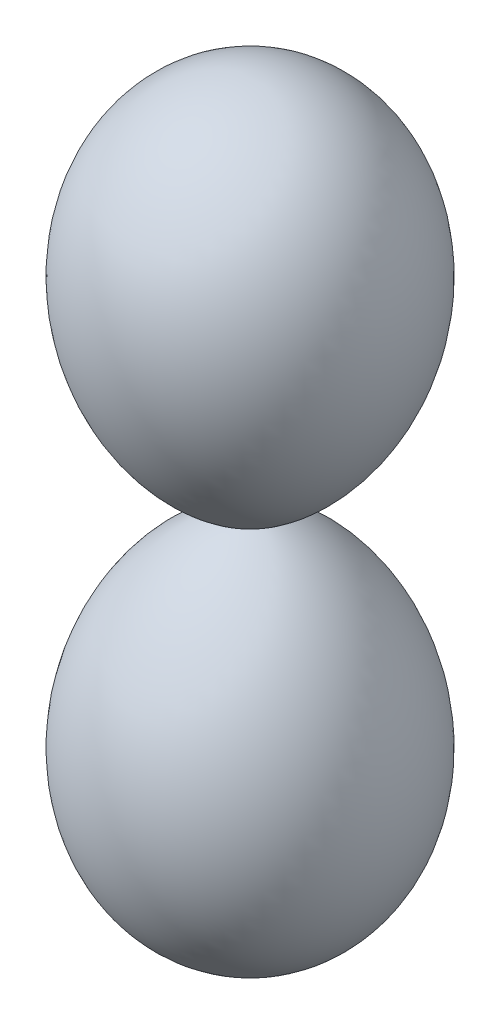
ISO-10303-21;
HEADER;
FILE_DESCRIPTION(('STEP AP214'),'2;1');
FILE_NAME('part.step','',(''),(''),'','','');
FILE_SCHEMA(('AUTOMOTIVE_DESIGN { 1 0 10303 214 1 1 1 1 }'));
ENDSEC;
DATA;
#1=APPLICATION_CONTEXT('core data for automotive mechanical design processes');
#2=APPLICATION_PROTOCOL_DEFINITION('international standard','automotive_design',2000,#1);
#3=PRODUCT_CONTEXT('',#1,'mechanical');
#4=PRODUCT('Part','Part','',(#3));
#5=PRODUCT_RELATED_PRODUCT_CATEGORY('part','',(#4));
#6=PRODUCT_DEFINITION_FORMATION('','',#4);
#7=PRODUCT_DEFINITION_CONTEXT('part definition',#1,'design');
#8=PRODUCT_DEFINITION('design','',#6,#7);
#9=PRODUCT_DEFINITION_SHAPE('','',#8);
#10=(LENGTH_UNIT() NAMED_UNIT(*) SI_UNIT(.MILLI.,.METRE.));
#11=(NAMED_UNIT(*) PLANE_ANGLE_UNIT() SI_UNIT($,.RADIAN.));
#12=(NAMED_UNIT(*) SI_UNIT($,.STERADIAN.) SOLID_ANGLE_UNIT());
#13=UNCERTAINTY_MEASURE_WITH_UNIT(LENGTH_MEASURE(1.E-05),#10,'distance_accuracy_value','');
#14=(GEOMETRIC_REPRESENTATION_CONTEXT(3) GLOBAL_UNCERTAINTY_ASSIGNED_CONTEXT((#13)) GLOBAL_UNIT_ASSIGNED_CONTEXT((#10,
#11,#12)) REPRESENTATION_CONTEXT('',''));
#15=CARTESIAN_POINT('',(0.,0.,0.));
#16=DIRECTION('',(0.,0.,1.));
#17=DIRECTION('',(1.,0.,0.));
#18=AXIS2_PLACEMENT_3D('',#15,#16,#17);
#19=CARTESIAN_POINT('',(-4.7725622094443E-10,-238.732414637843,0.));
#20=CARTESIAN_POINT('',(0.158232076679533,-238.732414637846,0.));
#21=CARTESIAN_POINT('',(0.457894285095555,-238.731206453633,0.));
#22=CARTESIAN_POINT('',(1.33411724123613,-238.725769624902,0.));
#23=CARTESIAN_POINT('',(1.73482868856289,-238.711272515166,0.));
#24=CARTESIAN_POINT('',(2.78425710097885,-238.689529601464,0.));
#25=CARTESIAN_POINT('',(3.32739160309815,-238.660544182287,0.));
#26=CARTESIAN_POINT('',(4.23355223532613,-238.62432065296,0.));
#27=CARTESIAN_POINT('',(4.89925492368032,-238.580864501907,0.));
#28=CARTESIAN_POINT('',(5.7104319987556,-238.530182307678,0.));
#29=CARTESIAN_POINT('',(6.43958727312057,-238.472281734505,0.));
#30=CARTESIAN_POINT('',(7.20986006760321,-238.407171527242,0.));
#31=CARTESIAN_POINT('',(7.96017032568307,-238.334861506403,0.));
#32=CARTESIAN_POINT('',(8.90675619193364,-238.235487824207,0.));
#33=CARTESIAN_POINT('',(10.0369176190403,-238.101885458897,0.));
#34=CARTESIAN_POINT('',(11.3551168200478,-237.925140187603,0.));
#35=CARTESIAN_POINT('',(12.8562017052987,-237.694636600636,0.));
#36=CARTESIAN_POINT('',(14.3533586397701,-237.435761168447,0.));
#37=CARTESIAN_POINT('',(15.8449516166903,-237.148667084164,0.));
#38=CARTESIAN_POINT('',(17.3311153917307,-236.833522985534,0.));
#39=CARTESIAN_POINT('',(18.8109473156162,-236.490512950005,0.));
#40=CARTESIAN_POINT('',(20.2841818168648,-236.119835733821,0.));
#41=CARTESIAN_POINT('',(21.7501805974457,-235.721704633685,0.));
#42=CARTESIAN_POINT('',(23.2085451840026,-235.296346024563,0.));
#43=CARTESIAN_POINT('',(24.6587488954614,-234.844000472762,0.));
#44=CARTESIAN_POINT('',(27.1815546232825,-234.005610228679,0.));
#45=CARTESIAN_POINT('',(30.028480640857,-232.941574968101,0.));
#46=CARTESIAN_POINT('',(33.8776473521546,-231.313146468423,0.));
#47=CARTESIAN_POINT('',(38.6436782619952,-228.95104066563,0.));
#48=CARTESIAN_POINT('',(43.263561165882,-226.31110096366,0.));
#49=CARTESIAN_POINT('',(48.3218777453472,-222.93613695319,0.));
#50=CARTESIAN_POINT('',(53.1406234937853,-219.227520161643,0.));
#51=CARTESIAN_POINT('',(57.704770636414,-215.210068516224,0.));
#52=CARTESIAN_POINT('',(62.0021064482989,-210.908728408396,0.));
#53=CARTESIAN_POINT('',(66.0230022292966,-206.348204319739,0.));
#54=CARTESIAN_POINT('',(69.7601506060879,-201.552671590483,0.));
#55=CARTESIAN_POINT('',(73.208302609377,-196.545553622644,0.));
#56=CARTESIAN_POINT('',(76.3639964055888,-191.349371223254,0.));
#57=CARTESIAN_POINT('',(79.225302095607,-185.985647265546,0.));
#58=CARTESIAN_POINT('',(81.7915879190387,-180.474849778129,0.));
#59=CARTESIAN_POINT('',(84.0633037951528,-174.836385457578,0.));
#60=CARTESIAN_POINT('',(86.0417919020458,-169.088614521051,0.));
#61=CARTESIAN_POINT('',(87.7291266930098,-163.248867849826,0.));
#62=CARTESIAN_POINT('',(89.1279692403513,-157.333494346972,0.));
#63=CARTESIAN_POINT('',(90.2414412709696,-151.357929952634,0.));
#64=CARTESIAN_POINT('',(91.073023490185,-145.336752282285,0.));
#65=CARTESIAN_POINT('',(91.6264676053499,-139.283751089973,0.));
#66=CARTESIAN_POINT('',(91.9755382294563,-131.694052431661,0.));
#67=CARTESIAN_POINT('',(91.8542202856993,-122.573727149589,0.));
#68=CARTESIAN_POINT('',(90.9431835804647,-111.966525473145,0.));
#69=CARTESIAN_POINT('',(88.8806382407823,-99.9761265255466,0.));
#70=CARTESIAN_POINT('',(85.8302707112358,-88.1986588231828,0.));
#71=CARTESIAN_POINT('',(81.8246811545247,-76.7111638067186,0.));
#72=CARTESIAN_POINT('',(76.8952028089212,-65.5887660246312,0.));
#73=CARTESIAN_POINT('',(71.0717302106872,-54.9070722264656,0.));
#74=CARTESIAN_POINT('',(64.3826382415461,-44.7443270024018,0.));
#75=CARTESIAN_POINT('',(56.8547880864718,-35.1853181620022,0.));
#76=CARTESIAN_POINT('',(48.5135266970851,-26.3250071270917,0.));
#77=CARTESIAN_POINT('',(39.3827463752414,-18.2776517597242,0.));
#78=CARTESIAN_POINT('',(29.5582310142145,-11.2399031653999,0.));
#79=CARTESIAN_POINT('',(20.3305356085143,-6.08871743160788,0.));
#80=CARTESIAN_POINT('',(12.744356959284,-2.90933258386499,0.));
#81=CARTESIAN_POINT('',(7.12341224832012,-1.19750019126883,0.));
#82=CARTESIAN_POINT('',(3.89252895991875,-0.472067618271856,0.));
#83=CARTESIAN_POINT('',(2.07335484696645,-0.174511200932266,0.));
#84=CARTESIAN_POINT('',(0.897060134224704,-0.049334904354582,0.));
#85=CARTESIAN_POINT('',(0.384889492249689,-0.0149554304814397,0.));
#86=CARTESIAN_POINT('',(0.237494876930605,-0.00718722380458769,0.));
#87=CARTESIAN_POINT('',(0.128470357743121,-0.00271402647858916,0.));
#88=CARTESIAN_POINT('',(0.0595324102199409,-0.000834124432396861,0.));
#89=CARTESIAN_POINT('',(0.0215802431765513,-0.000158546193448969,0.));
#90=CARTESIAN_POINT('',(0.00601456332271598,-2.8814745771998E-05,0.));
#91=CARTESIAN_POINT('',(0.00226332586843716,-7.09897520035942E-06,0.));
#92=CARTESIAN_POINT('',(0.000617382432931194,-2.07785651660229E-06,0.));
#93=CARTESIAN_POINT('',(0.000279755068673513,1.50416390341048E-06,0.));
#94=CARTESIAN_POINT('',(0.00210149461509932,6.27003126554018E-06,0.));
#95=CARTESIAN_POINT('',(0.00589671844431724,2.65360242960475E-05,0.));
#96=CARTESIAN_POINT('',(0.0112805326680086,7.13562176892201E-05,0.));
#97=CARTESIAN_POINT('',(0.0305289100184179,0.000303177845071765,0.));
#98=CARTESIAN_POINT('',(0.0712819197580394,0.00110400770651525,0.));
#99=CARTESIAN_POINT('',(0.141479089271569,0.00323009550125977,0.));
#100=CARTESIAN_POINT('',(0.247777480304238,0.00766044632399727,0.));
#101=CARTESIAN_POINT('',(0.387344121479015,0.015233331058034,0.));
#102=CARTESIAN_POINT('',(0.765293895608642,0.0402892322441072,0.));
#103=CARTESIAN_POINT('',(1.76323968566842,0.136675824427676,0.));
#104=CARTESIAN_POINT('',(3.36387616684448,0.3768892252142,0.));
#105=CARTESIAN_POINT('',(6.36466963544672,1.00073529646894,0.));
#106=CARTESIAN_POINT('',(11.5987515577288,2.51183649705219,0.));
#107=CARTESIAN_POINT('',(18.8361721088028,5.39176254323415,0.));
#108=CARTESIAN_POINT('',(27.7741606764427,10.1526778853343,0.));
#109=CARTESIAN_POINT('',(37.3635149997212,16.7120751135218,0.));
#110=CARTESIAN_POINT('',(46.5021144389872,24.4269749717582,0.));
#111=CARTESIAN_POINT('',(54.8833882988521,32.9552349198596,0.));
#112=CARTESIAN_POINT('',(62.4850545993603,42.1832254581309,0.));
#113=CARTESIAN_POINT('',(69.283344342679,52.0169284365161,0.));
#114=CARTESIAN_POINT('',(75.253240179495,62.3738699611749,0.));
#115=CARTESIAN_POINT('',(80.3682085916487,73.1783725486289,0.));
#116=CARTESIAN_POINT('',(84.6003171330624,84.3581792626014,0.));
#117=CARTESIAN_POINT('',(87.9202688206881,95.8421218079766,0.));
#118=CARTESIAN_POINT('',(90.2975070740175,107.557884759814,0.));
#119=CARTESIAN_POINT('',(91.7004924562847,119.430335889641,0.));
#120=CARTESIAN_POINT('',(92.0970831275263,131.379537208948,0.));
#121=CARTESIAN_POINT('',(91.4552242339768,143.319005121487,0.));
#122=CARTESIAN_POINT('',(89.9578598814957,153.674462156347,0.));
#123=CARTESIAN_POINT('',(87.9882943875677,162.419291140211,0.));
#124=CARTESIAN_POINT('',(85.8822444309774,169.582315916762,0.));
#125=CARTESIAN_POINT('',(83.9160860776653,175.222534780625,0.));
#126=CARTESIAN_POINT('',(81.6666852445869,180.756040038159,0.));
#127=CARTESIAN_POINT('',(79.1328125298337,186.165357552259,0.));
#128=CARTESIAN_POINT('',(76.3140902080916,191.432009653319,0.));
#129=CARTESIAN_POINT('',(73.2111507751566,196.536547930299,0.));
#130=CARTESIAN_POINT('',(69.8258274619664,201.458562748268,0.));
#131=CARTESIAN_POINT('',(66.161389923568,206.176695653163,0.));
#132=CARTESIAN_POINT('',(62.2227619532323,210.668751130573,0.));
#133=CARTESIAN_POINT('',(58.0167789016142,214.911821755991,0.));
#134=CARTESIAN_POINT('',(53.5524522664193,218.882473277132,0.));
#135=CARTESIAN_POINT('',(49.4300772951687,222.097725622599,0.));
#136=CARTESIAN_POINT('',(45.7510117458816,224.653876321486,0.));
#137=CARTESIAN_POINT('',(42.5932758703132,226.643607307594,0.));
#138=CARTESIAN_POINT('',(40.0142702826691,228.148330474037,0.));
#139=CARTESIAN_POINT('',(37.3848636793698,229.563229388745,0.));
#140=CARTESIAN_POINT('',(34.7077612110119,230.885627234128,0.));
#141=CARTESIAN_POINT('',(31.9856809120083,232.112943584906,0.));
#142=CARTESIAN_POINT('',(29.2218021411582,233.242724227991,0.));
#143=CARTESIAN_POINT('',(26.4189885724234,234.27265202537,0.));
#144=CARTESIAN_POINT('',(23.5810783773457,235.200564676812,0.));
#145=CARTESIAN_POINT('',(20.7106979921368,236.024473512187,0.));
#146=CARTESIAN_POINT('',(18.1752325286338,236.652813301378,0.));
#147=CARTESIAN_POINT('',(15.9852497825873,237.124262620415,0.));
#148=CARTESIAN_POINT('',(14.1534806760368,237.471954287358,0.));
#149=CARTESIAN_POINT('',(12.6791681861307,237.722839921568,0.));
#150=CARTESIAN_POINT('',(11.2085969143078,237.946314415323,0.));
#151=CARTESIAN_POINT('',(9.71921701459229,238.142249374956,0.));
#152=CARTESIAN_POINT('',(8.38974629170306,238.294919882224,0.));
#153=CARTESIAN_POINT('',(7.15373181643998,238.412172888274,0.));
#154=CARTESIAN_POINT('',(6.1230028395523,238.500961567921,0.));
#155=CARTESIAN_POINT('',(5.10385077691377,238.567316176587,0.));
#156=CARTESIAN_POINT('',(4.34172933143685,238.622635350862,0.));
#157=CARTESIAN_POINT('',(3.15859028467359,238.6613718932,0.));
#158=CARTESIAN_POINT('',(3.15043481904094,238.687663654982,0.));
#159=CARTESIAN_POINT('',(1.54338323117279,238.704962194163,0.));
#160=CARTESIAN_POINT('',(1.82865832528686,238.716035182944,0.));
#161=CARTESIAN_POINT('',(1.1242664640968,238.72641615586,0.));
#162=CARTESIAN_POINT('',(0.488179432090432,238.731030376718,0.));
#163=CARTESIAN_POINT('',(0.195571604345566,238.732414637843,0.));
#164=CARTESIAN_POINT('',(-3.4119719901684E-10,238.732414637843,0.));
#165=B_SPLINE_CURVE_WITH_KNOTS('',4,(#19,#20,#21,#22,#23,#24,#25,#26,#27,#28,#29,#30,#31,#32,
#33,#34,#35,#36,#37,#38,#39,#40,#41,#42,#43,#44,#45,#46,#47,#48,#49,#50,#51,#52,#53,#54,#55,#56,
#57,#58,#59,#60,#61,#62,#63,#64,#65,#66,#67,#68,#69,#70,#71,#72,#73,#74,#75,#76,#77,#78,#79,#80,
#81,#82,#83,#84,#85,#86,#87,#88,#89,#90,#91,#92,#93,#94,#95,#96,#97,#98,#99,#100,#101,#102,#103,
#104,#105,#106,#107,#108,#109,#110,#111,#112,#113,#114,#115,#116,#117,#118,#119,#120,#121,#122,
#123,#124,#125,#126,#127,#128,#129,#130,#131,#132,#133,#134,#135,#136,#137,#138,#139,#140,#141,
#142,#143,#144,#145,#146,#147,#148,#149,#150,#151,#152,#153,#154,#155,#156,#157,#158,#159,#160,
#161,#162,#163,#164),.UNSPECIFIED.,.F.,.F.,(5,1,1,1,1,1,1,1,1,1,1,1,1,1,1,1,1,1,1,1,1,1,1,1,1,1,
1,1,1,1,1,1,1,1,1,1,1,1,1,1,1,1,1,1,1,1,1,1,1,1,1,1,1,1,1,1,1,1,1,1,1,1,1,1,1,1,1,1,1,1,1,1,1,1,
1,1,1,1,1,1,1,1,1,1,1,1,1,1,1,1,1,1,1,1,1,1,1,1,1,1,1,1,1,1,1,1,1,1,1,1,1,1,1,1,1,1,1,1,1,1,1,1,
1,1,1,1,1,1,1,1,1,1,1,1,1,1,1,1,1,1,1,1,5),(0.0833330527714072,0.0842935155583551,
0.0852539783453029,0.0862144411322508,0.0871749039191986,0.0881353667061464,0.0890958294930943,
0.0900562922800421,0.09101675506699,0.0919772178539378,0.0929376806408856,0.0938981434278335,
0.0948586062147813,0.096779531788677,0.0987004573625727,0.100621379441295,0.102542301520017,
0.10446322359874,0.106384145677462,0.108305067756185,0.110225989834907,0.112146911913629,
0.114067833992352,0.115988763849272,0.117909693706192,0.125593413133872,0.129435272847713,
0.137118955656424,0.144802638465134,0.15248635718367,0.160170075902205,0.167853779541072,
0.175537483179939,0.183221222354883,0.190904961529827,0.19858866214955,0.206272362769274,
0.213956101880218,0.221639840991163,0.22932356531427,0.237007289637377,0.244691010833719,
0.252374732030061,0.26005846764722,0.267742203264378,0.275425936947752,0.283109670631126,
0.298477139476299,0.313844621513222,0.329212080691398,0.344579568798603,0.359947038714418,
0.375314543231063,0.390682008500001,0.406049508145162,0.421416993170165,0.436784411404297,
0.452151817232296,0.467519373248969,0.482431931983147,0.490114312074107,0.493661553051073,
0.497208794028038,0.499171934137204,0.499431691136885,0.499642767919053,0.499805120898737,
0.499918642274205,0.499983361416502,0.499992050253091,0.499996394671386,0.499998566880534,
0.499999652985107,0.500000739089681,0.500004371693776,0.500008004297871,0.500015269506061,
0.50002979992244,0.500101085662259,0.500214580103975,0.500370257450525,0.500568082321309,
0.500808009763666,0.502130553568197,0.505440226713955,0.508749899859712,0.516302202951694,
0.529656724696112,0.544757486779786,0.559857801446032,0.574958656537152,0.590059081249971,
0.605159497672045,0.620260076831504,0.635360587991576,0.650461261697782,0.665561729472944,
0.680662287983405,0.695762860074538,0.710863376350918,0.725963924301179,0.741064460106714,
0.756164959574445,0.763715211511486,0.771265463448527,0.778815745451189,0.786366027453851,
0.793916322530456,0.801466617607061,0.809016812299688,0.816567006992315,0.824117310787132,
0.831667614581949,0.839217863498603,0.846768112415257,0.854318328808391,0.858093437004958,
0.861868545201525,0.865643690400016,0.869418835598507,0.873193980796998,0.876969125995488,
0.880744239743082,0.884519353490675,0.888294467238269,0.892069580985863,0.895844697897949,
0.897732256353993,0.899619814810036,0.90150737326608,0.903394931722123,0.905282490178166,
0.90717004863421,0.908357160958508,0.909544273282805,0.910731385607103,0.911918497931401,
0.913105610255699,0.913699166417848,0.914292722579997,0.914886278742145,0.915479834904294,
0.916666947228592),.UNSPECIFIED.);
#166=CARTESIAN_POINT('',(-3.18224450895836E-10,238.732414637843,0.));
#167=DIRECTION('',(0.,1.,0.));
#168=AXIS1_PLACEMENT('',#166,#167);
#169=SURFACE_OF_REVOLUTION('',#165,#168);
#170=CARTESIAN_POINT('',(-3.18224450895836E-10,238.732414637843,0.));
#171=VERTEX_POINT('',#170);
#172=VERTEX_LOOP('',#171);
#173=FACE_BOUND('',#172,.T.);
#174=CARTESIAN_POINT('',(-3.18165978318349E-10,-238.732414637843,0.));
#175=VERTEX_POINT('',#174);
#176=VERTEX_LOOP('',#175);
#177=FACE_BOUND('',#176,.T.);
#178=ADVANCED_FACE('F39',(#173,#177),#169,.T.);
#179=CLOSED_SHELL('',(#178));
#180=MANIFOLD_SOLID_BREP('B2',#179);
#181=ADVANCED_BREP_SHAPE_REPRESENTATION('',(#18,#180),#14);
#182=SHAPE_DEFINITION_REPRESENTATION(#9,#181);
ENDSEC;
END-ISO-10303-21;
